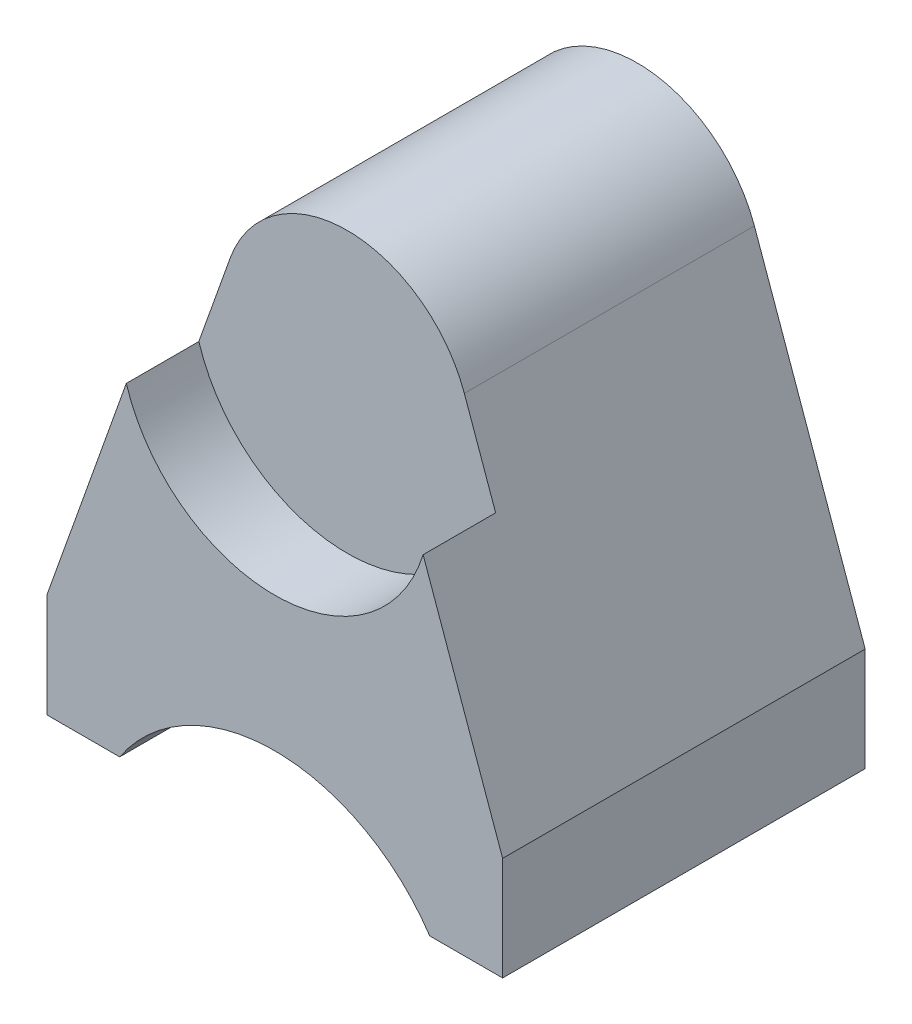
ISO-10303-21;
HEADER;
FILE_DESCRIPTION(('STEP AP214'),'2;1');
FILE_NAME('part.step','',(''),(''),'','','');
FILE_SCHEMA(('AUTOMOTIVE_DESIGN { 1 0 10303 214 1 1 1 1 }'));
ENDSEC;
DATA;
#1=APPLICATION_CONTEXT('core data for automotive mechanical design processes');
#2=APPLICATION_PROTOCOL_DEFINITION('international standard','automotive_design',2000,#1);
#3=PRODUCT_CONTEXT('',#1,'mechanical');
#4=PRODUCT('Part','Part','',(#3));
#5=PRODUCT_RELATED_PRODUCT_CATEGORY('part','',(#4));
#6=PRODUCT_DEFINITION_FORMATION('','',#4);
#7=PRODUCT_DEFINITION_CONTEXT('part definition',#1,'design');
#8=PRODUCT_DEFINITION('design','',#6,#7);
#9=PRODUCT_DEFINITION_SHAPE('','',#8);
#10=(LENGTH_UNIT() NAMED_UNIT(*) SI_UNIT(.MILLI.,.METRE.));
#11=(NAMED_UNIT(*) PLANE_ANGLE_UNIT() SI_UNIT($,.RADIAN.));
#12=(NAMED_UNIT(*) SI_UNIT($,.STERADIAN.) SOLID_ANGLE_UNIT());
#13=UNCERTAINTY_MEASURE_WITH_UNIT(LENGTH_MEASURE(1.E-05),#10,'distance_accuracy_value','');
#14=(GEOMETRIC_REPRESENTATION_CONTEXT(3) GLOBAL_UNCERTAINTY_ASSIGNED_CONTEXT((#13)) GLOBAL_UNIT_ASSIGNED_CONTEXT((#10,
#11,#12)) REPRESENTATION_CONTEXT('',''));
#15=CARTESIAN_POINT('',(0.,0.,0.));
#16=DIRECTION('',(0.,0.,1.));
#17=DIRECTION('',(1.,0.,0.));
#18=AXIS2_PLACEMENT_3D('',#15,#16,#17);
#19=CARTESIAN_POINT('',(0.,36.,17.5));
#20=DIRECTION('',(0.,0.,-1.));
#21=DIRECTION('',(-1.,0.,0.));
#22=AXIS2_PLACEMENT_3D('',#19,#20,#21);
#23=CYLINDRICAL_SURFACE('',#22,12.);
#24=CARTESIAN_POINT('',(0.,36.,10.5));
#25=DIRECTION('',(0.,0.,1.));
#26=DIRECTION('',(1.,0.,0.));
#27=AXIS2_PLACEMENT_3D('',#24,#25,#26);
#28=CIRCLE('',#27,12.);
#29=CARTESIAN_POINT('',(11.3042444216532,40.0266683567835,10.5));
#30=VERTEX_POINT('',#29);
#31=CARTESIAN_POINT('',(-11.3042444216532,40.0266683567835,10.5));
#32=VERTEX_POINT('',#31);
#33=EDGE_CURVE('E56',#30,#32,#28,.T.);
#34=ORIENTED_EDGE('',*,*,#33,.F.);
#35=DIRECTION('',(0.,0.,-1.));
#36=VECTOR('',#35,1.);
#37=CARTESIAN_POINT('',(11.3042444216532,40.0266683567835,17.5));
#38=LINE('',#37,#36);
#39=CARTESIAN_POINT('',(11.3042444216532,40.0266683567835,-17.5));
#40=VERTEX_POINT('',#39);
#41=EDGE_CURVE('E190',#30,#40,#38,.T.);
#42=ORIENTED_EDGE('',*,*,#41,.T.);
#43=CARTESIAN_POINT('',(0.,36.,-17.5));
#44=DIRECTION('',(0.,0.,1.));
#45=DIRECTION('',(-1.,0.,0.));
#46=AXIS2_PLACEMENT_3D('',#43,#44,#45);
#47=CIRCLE('',#46,12.);
#48=CARTESIAN_POINT('',(-11.3042444216532,40.0266683567835,-17.5));
#49=VERTEX_POINT('',#48);
#50=EDGE_CURVE('E170',#40,#49,#47,.T.);
#51=ORIENTED_EDGE('',*,*,#50,.T.);
#52=DIRECTION('',(0.,0.,-1.));
#53=VECTOR('',#52,1.);
#54=CARTESIAN_POINT('',(-11.3042444216532,40.0266683567835,17.5));
#55=LINE('',#54,#53);
#56=EDGE_CURVE('E142',#32,#49,#55,.T.);
#57=ORIENTED_EDGE('',*,*,#56,.F.);
#58=EDGE_LOOP('',(#34,#42,#51,#57));
#59=FACE_BOUND('',#58,.T.);
#60=ADVANCED_FACE('F42',(#59),#23,.T.);
#61=CARTESIAN_POINT('',(0.,-10.,17.5));
#62=DIRECTION('',(0.,0.,-1.));
#63=DIRECTION('',(-1.,0.,0.));
#64=AXIS2_PLACEMENT_3D('',#61,#62,#63);
#65=PLANE('',#64);
#66=CARTESIAN_POINT('',(0.,36.,17.5));
#67=DIRECTION('',(0.,0.,1.));
#68=DIRECTION('',(1.,0.,0.));
#69=AXIS2_PLACEMENT_3D('',#66,#67,#68);
#70=CIRCLE('',#69,15.);
#71=CARTESIAN_POINT('',(-14.3242456892409,31.5484850405436,17.5));
#72=VERTEX_POINT('',#71);
#73=CARTESIAN_POINT('',(14.3242456892409,31.5484850405436,17.5));
#74=VERTEX_POINT('',#73);
#75=EDGE_CURVE('E129',#72,#74,#70,.T.);
#76=ORIENTED_EDGE('',*,*,#75,.F.);
#77=DIRECTION('',(-0.335555696398626,-0.942020368471103,0.));
#78=VECTOR('',#77,1.);
#79=CARTESIAN_POINT('',(-22.,10.,17.5));
#80=LINE('',#79,#78);
#81=CARTESIAN_POINT('',(-22.,10.,17.5));
#82=VERTEX_POINT('',#81);
#83=EDGE_CURVE('E119',#72,#82,#80,.T.);
#84=ORIENTED_EDGE('',*,*,#83,.T.);
#85=DIRECTION('',(0.,-1.,0.));
#86=VECTOR('',#85,1.);
#87=CARTESIAN_POINT('',(-22.,0.,17.5));
#88=LINE('',#87,#86);
#89=CARTESIAN_POINT('',(-22.,0.,17.5));
#90=VERTEX_POINT('',#89);
#91=EDGE_CURVE('E125',#82,#90,#88,.T.);
#92=ORIENTED_EDGE('',*,*,#91,.T.);
#93=DIRECTION('',(1.,0.,0.));
#94=VECTOR('',#93,1.);
#95=CARTESIAN_POINT('',(-14.9666295470958,0.,17.5));
#96=LINE('',#95,#94);
#97=CARTESIAN_POINT('',(-14.9666295470958,0.,17.5));
#98=VERTEX_POINT('',#97);
#99=EDGE_CURVE('E66',#90,#98,#96,.T.);
#100=ORIENTED_EDGE('',*,*,#99,.T.);
#101=CARTESIAN_POINT('',(0.,-10.,17.5));
#102=DIRECTION('',(0.,0.,-1.));
#103=DIRECTION('',(-1.,0.,0.));
#104=AXIS2_PLACEMENT_3D('',#101,#102,#103);
#105=CIRCLE('',#104,18.);
#106=CARTESIAN_POINT('',(14.9666295470958,0.,17.5));
#107=VERTEX_POINT('',#106);
#108=EDGE_CURVE('E179',#98,#107,#105,.T.);
#109=ORIENTED_EDGE('',*,*,#108,.T.);
#110=DIRECTION('',(1.,0.,0.));
#111=VECTOR('',#110,1.);
#112=CARTESIAN_POINT('',(14.9666295470958,0.,17.5));
#113=LINE('',#112,#111);
#114=CARTESIAN_POINT('',(22.,0.,17.5));
#115=VERTEX_POINT('',#114);
#116=EDGE_CURVE('E106',#107,#115,#113,.T.);
#117=ORIENTED_EDGE('',*,*,#116,.T.);
#118=DIRECTION('',(0.,1.,0.));
#119=VECTOR('',#118,1.);
#120=CARTESIAN_POINT('',(22.,0.,17.5));
#121=LINE('',#120,#119);
#122=CARTESIAN_POINT('',(22.,10.,17.5));
#123=VERTEX_POINT('',#122);
#124=EDGE_CURVE('E225',#115,#123,#121,.T.);
#125=ORIENTED_EDGE('',*,*,#124,.T.);
#126=DIRECTION('',(-0.335555696398626,0.942020368471103,0.));
#127=VECTOR('',#126,1.);
#128=CARTESIAN_POINT('',(22.,10.,17.5));
#129=LINE('',#128,#127);
#130=EDGE_CURVE('E133',#123,#74,#129,.T.);
#131=ORIENTED_EDGE('',*,*,#130,.T.);
#132=EDGE_LOOP('',(#76,#84,#92,#100,#109,#117,#125,#131));
#133=FACE_BOUND('',#132,.T.);
#134=ADVANCED_FACE('F122',(#133),#65,.F.);
#135=CARTESIAN_POINT('',(0.,-10.,17.5));
#136=DIRECTION('',(0.,0.,-1.));
#137=DIRECTION('',(-1.,0.,0.));
#138=AXIS2_PLACEMENT_3D('',#135,#136,#137);
#139=CYLINDRICAL_SURFACE('',#138,18.);
#140=CARTESIAN_POINT('',(0.,-10.,-17.5));
#141=DIRECTION('',(0.,0.,-1.));
#142=DIRECTION('',(-1.,0.,0.));
#143=AXIS2_PLACEMENT_3D('',#140,#141,#142);
#144=CIRCLE('',#143,18.);
#145=CARTESIAN_POINT('',(-14.9666295470958,0.,-17.5));
#146=VERTEX_POINT('',#145);
#147=CARTESIAN_POINT('',(14.9666295470958,0.,-17.5));
#148=VERTEX_POINT('',#147);
#149=EDGE_CURVE('E154',#146,#148,#144,.T.);
#150=ORIENTED_EDGE('',*,*,#149,.T.);
#151=DIRECTION('',(0.,0.,-1.));
#152=VECTOR('',#151,1.);
#153=CARTESIAN_POINT('',(14.9666295470958,0.,17.5));
#154=LINE('',#153,#152);
#155=EDGE_CURVE('E52',#107,#148,#154,.T.);
#156=ORIENTED_EDGE('',*,*,#155,.F.);
#157=ORIENTED_EDGE('',*,*,#108,.F.);
#158=DIRECTION('',(0.,0.,-1.));
#159=VECTOR('',#158,1.);
#160=CARTESIAN_POINT('',(-14.9666295470958,0.,17.5));
#161=LINE('',#160,#159);
#162=EDGE_CURVE('E148',#98,#146,#161,.T.);
#163=ORIENTED_EDGE('',*,*,#162,.T.);
#164=EDGE_LOOP('',(#150,#156,#157,#163));
#165=FACE_BOUND('',#164,.T.);
#166=ADVANCED_FACE('F46',(#165),#139,.F.);
#167=CARTESIAN_POINT('',(14.9666295470958,0.,17.5));
#168=DIRECTION('',(0.,1.,0.));
#169=DIRECTION('',(0.,0.,1.));
#170=AXIS2_PLACEMENT_3D('',#167,#168,#169);
#171=PLANE('',#170);
#172=DIRECTION('',(1.,0.,0.));
#173=VECTOR('',#172,1.);
#174=CARTESIAN_POINT('',(14.9666295470958,0.,-17.5));
#175=LINE('',#174,#173);
#176=CARTESIAN_POINT('',(22.,0.,-17.5));
#177=VERTEX_POINT('',#176);
#178=EDGE_CURVE('E156',#148,#177,#175,.T.);
#179=ORIENTED_EDGE('',*,*,#178,.T.);
#180=DIRECTION('',(0.,0.,-1.));
#181=VECTOR('',#180,1.);
#182=CARTESIAN_POINT('',(22.,0.,17.5));
#183=LINE('',#182,#181);
#184=EDGE_CURVE('E191',#115,#177,#183,.T.);
#185=ORIENTED_EDGE('',*,*,#184,.F.);
#186=ORIENTED_EDGE('',*,*,#116,.F.);
#187=ORIENTED_EDGE('',*,*,#155,.T.);
#188=EDGE_LOOP('',(#179,#185,#186,#187));
#189=FACE_BOUND('',#188,.T.);
#190=ADVANCED_FACE('F199',(#189),#171,.F.);
#191=CARTESIAN_POINT('',(22.,0.,17.5));
#192=DIRECTION('',(-1.,0.,0.));
#193=DIRECTION('',(0.,0.,1.));
#194=AXIS2_PLACEMENT_3D('',#191,#192,#193);
#195=PLANE('',#194);
#196=DIRECTION('',(0.,1.,0.));
#197=VECTOR('',#196,1.);
#198=CARTESIAN_POINT('',(22.,0.,-17.5));
#199=LINE('',#198,#197);
#200=CARTESIAN_POINT('',(22.,10.,-17.5));
#201=VERTEX_POINT('',#200);
#202=EDGE_CURVE('E165',#177,#201,#199,.T.);
#203=ORIENTED_EDGE('',*,*,#202,.T.);
#204=DIRECTION('',(0.,0.,-1.));
#205=VECTOR('',#204,1.);
#206=CARTESIAN_POINT('',(22.,10.,17.5));
#207=LINE('',#206,#205);
#208=EDGE_CURVE('E189',#123,#201,#207,.T.);
#209=ORIENTED_EDGE('',*,*,#208,.F.);
#210=ORIENTED_EDGE('',*,*,#124,.F.);
#211=ORIENTED_EDGE('',*,*,#184,.T.);
#212=EDGE_LOOP('',(#203,#209,#210,#211));
#213=FACE_BOUND('',#212,.T.);
#214=ADVANCED_FACE('F209',(#213),#195,.F.);
#215=CARTESIAN_POINT('',(22.,10.,17.5));
#216=DIRECTION('',(-0.942020368471103,-0.335555696398626,0.));
#217=DIRECTION('',(0.335555696398626,-0.942020368471103,0.));
#218=AXIS2_PLACEMENT_3D('',#215,#216,#217);
#219=PLANE('',#218);
#220=DIRECTION('',(-0.335555696398626,0.942020368471103,0.));
#221=VECTOR('',#220,1.);
#222=CARTESIAN_POINT('',(22.,10.,10.5));
#223=LINE('',#222,#221);
#224=CARTESIAN_POINT('',(14.3242456892409,31.5484850405436,10.5));
#225=VERTEX_POINT('',#224);
#226=EDGE_CURVE('E159',#225,#30,#223,.T.);
#227=ORIENTED_EDGE('',*,*,#226,.F.);
#228=DIRECTION('',(0.,0.,1.));
#229=VECTOR('',#228,1.);
#230=CARTESIAN_POINT('',(14.3242456892409,31.5484850405436,10.5));
#231=LINE('',#230,#229);
#232=EDGE_CURVE('E217',#225,#74,#231,.T.);
#233=ORIENTED_EDGE('',*,*,#232,.T.);
#234=ORIENTED_EDGE('',*,*,#130,.F.);
#235=ORIENTED_EDGE('',*,*,#208,.T.);
#236=DIRECTION('',(-0.335555696398626,0.942020368471103,0.));
#237=VECTOR('',#236,1.);
#238=CARTESIAN_POINT('',(22.,10.,-17.5));
#239=LINE('',#238,#237);
#240=EDGE_CURVE('E164',#201,#40,#239,.T.);
#241=ORIENTED_EDGE('',*,*,#240,.T.);
#242=ORIENTED_EDGE('',*,*,#41,.F.);
#243=EDGE_LOOP('',(#227,#233,#234,#235,#241,#242));
#244=FACE_BOUND('',#243,.T.);
#245=ADVANCED_FACE('F214',(#244),#219,.F.);
#246=CARTESIAN_POINT('',(-22.,10.,17.5));
#247=DIRECTION('',(0.942020368471103,-0.335555696398626,0.));
#248=DIRECTION('',(0.335555696398626,0.942020368471103,0.));
#249=AXIS2_PLACEMENT_3D('',#246,#247,#248);
#250=PLANE('',#249);
#251=ORIENTED_EDGE('',*,*,#83,.F.);
#252=DIRECTION('',(0.,0.,1.));
#253=VECTOR('',#252,1.);
#254=CARTESIAN_POINT('',(-14.3242456892409,31.5484850405436,10.5));
#255=LINE('',#254,#253);
#256=CARTESIAN_POINT('',(-14.3242456892409,31.5484850405436,10.5));
#257=VERTEX_POINT('',#256);
#258=EDGE_CURVE('E237',#72,#257,#255,.F.);
#259=ORIENTED_EDGE('',*,*,#258,.T.);
#260=DIRECTION('',(-0.335555696398626,-0.942020368471103,0.));
#261=VECTOR('',#260,1.);
#262=CARTESIAN_POINT('',(-22.,10.,10.5));
#263=LINE('',#262,#261);
#264=EDGE_CURVE('E11',#32,#257,#263,.T.);
#265=ORIENTED_EDGE('',*,*,#264,.F.);
#266=ORIENTED_EDGE('',*,*,#56,.T.);
#267=DIRECTION('',(-0.335555696398626,-0.942020368471103,0.));
#268=VECTOR('',#267,1.);
#269=CARTESIAN_POINT('',(-22.,10.,-17.5));
#270=LINE('',#269,#268);
#271=CARTESIAN_POINT('',(-22.,10.,-17.5));
#272=VERTEX_POINT('',#271);
#273=EDGE_CURVE('E137',#49,#272,#270,.T.);
#274=ORIENTED_EDGE('',*,*,#273,.T.);
#275=DIRECTION('',(0.,0.,-1.));
#276=VECTOR('',#275,1.);
#277=CARTESIAN_POINT('',(-22.,10.,17.5));
#278=LINE('',#277,#276);
#279=EDGE_CURVE('E136',#82,#272,#278,.T.);
#280=ORIENTED_EDGE('',*,*,#279,.F.);
#281=EDGE_LOOP('',(#251,#259,#265,#266,#274,#280));
#282=FACE_BOUND('',#281,.T.);
#283=ADVANCED_FACE('F140',(#282),#250,.F.);
#284=CARTESIAN_POINT('',(-22.,0.,17.5));
#285=DIRECTION('',(1.,0.,0.));
#286=DIRECTION('',(0.,0.,-1.));
#287=AXIS2_PLACEMENT_3D('',#284,#285,#286);
#288=PLANE('',#287);
#289=DIRECTION('',(0.,-1.,0.));
#290=VECTOR('',#289,1.);
#291=CARTESIAN_POINT('',(-22.,0.,-17.5));
#292=LINE('',#291,#290);
#293=CARTESIAN_POINT('',(-22.,0.,-17.5));
#294=VERTEX_POINT('',#293);
#295=EDGE_CURVE('E172',#272,#294,#292,.T.);
#296=ORIENTED_EDGE('',*,*,#295,.T.);
#297=DIRECTION('',(0.,0.,-1.));
#298=VECTOR('',#297,1.);
#299=CARTESIAN_POINT('',(-22.,0.,17.5));
#300=LINE('',#299,#298);
#301=EDGE_CURVE('E143',#90,#294,#300,.T.);
#302=ORIENTED_EDGE('',*,*,#301,.F.);
#303=ORIENTED_EDGE('',*,*,#91,.F.);
#304=ORIENTED_EDGE('',*,*,#279,.T.);
#305=EDGE_LOOP('',(#296,#302,#303,#304));
#306=FACE_BOUND('',#305,.T.);
#307=ADVANCED_FACE('F147',(#306),#288,.F.);
#308=CARTESIAN_POINT('',(-14.9666295470958,0.,17.5));
#309=DIRECTION('',(0.,1.,0.));
#310=DIRECTION('',(0.,0.,1.));
#311=AXIS2_PLACEMENT_3D('',#308,#309,#310);
#312=PLANE('',#311);
#313=DIRECTION('',(1.,0.,0.));
#314=VECTOR('',#313,1.);
#315=CARTESIAN_POINT('',(-14.9666295470958,0.,-17.5));
#316=LINE('',#315,#314);
#317=EDGE_CURVE('E102',#294,#146,#316,.T.);
#318=ORIENTED_EDGE('',*,*,#317,.T.);
#319=ORIENTED_EDGE('',*,*,#162,.F.);
#320=ORIENTED_EDGE('',*,*,#99,.F.);
#321=ORIENTED_EDGE('',*,*,#301,.T.);
#322=EDGE_LOOP('',(#318,#319,#320,#321));
#323=FACE_BOUND('',#322,.T.);
#324=ADVANCED_FACE('F312',(#323),#312,.F.);
#325=CARTESIAN_POINT('',(0.,-10.,-17.5));
#326=DIRECTION('',(0.,0.,-1.));
#327=DIRECTION('',(-1.,0.,0.));
#328=AXIS2_PLACEMENT_3D('',#325,#326,#327);
#329=PLANE('',#328);
#330=ORIENTED_EDGE('',*,*,#149,.F.);
#331=ORIENTED_EDGE('',*,*,#317,.F.);
#332=ORIENTED_EDGE('',*,*,#295,.F.);
#333=ORIENTED_EDGE('',*,*,#273,.F.);
#334=ORIENTED_EDGE('',*,*,#50,.F.);
#335=ORIENTED_EDGE('',*,*,#240,.F.);
#336=ORIENTED_EDGE('',*,*,#202,.F.);
#337=ORIENTED_EDGE('',*,*,#178,.F.);
#338=EDGE_LOOP('',(#330,#331,#332,#333,#334,#335,#336,#337));
#339=FACE_BOUND('',#338,.T.);
#340=ADVANCED_FACE('F204',(#339),#329,.T.);
#341=CARTESIAN_POINT('',(0.,36.,10.5));
#342=DIRECTION('',(0.,0.,1.));
#343=DIRECTION('',(1.,0.,0.));
#344=AXIS2_PLACEMENT_3D('',#341,#342,#343);
#345=PLANE('',#344);
#346=ORIENTED_EDGE('',*,*,#226,.T.);
#347=ORIENTED_EDGE('',*,*,#33,.T.);
#348=ORIENTED_EDGE('',*,*,#264,.T.);
#349=CARTESIAN_POINT('',(0.,36.,10.5));
#350=DIRECTION('',(0.,0.,1.));
#351=DIRECTION('',(1.,0.,0.));
#352=AXIS2_PLACEMENT_3D('',#349,#350,#351);
#353=CIRCLE('',#352,15.);
#354=EDGE_CURVE('E236',#257,#225,#353,.T.);
#355=ORIENTED_EDGE('',*,*,#354,.T.);
#356=EDGE_LOOP('',(#346,#347,#348,#355));
#357=FACE_BOUND('',#356,.T.);
#358=ADVANCED_FACE('F247',(#357),#345,.T.);
#359=CARTESIAN_POINT('',(0.,36.,10.5));
#360=DIRECTION('',(0.,0.,1.));
#361=DIRECTION('',(1.,0.,0.));
#362=AXIS2_PLACEMENT_3D('',#359,#360,#361);
#363=CYLINDRICAL_SURFACE('',#362,15.);
#364=ORIENTED_EDGE('',*,*,#354,.F.);
#365=ORIENTED_EDGE('',*,*,#258,.F.);
#366=ORIENTED_EDGE('',*,*,#75,.T.);
#367=ORIENTED_EDGE('',*,*,#232,.F.);
#368=EDGE_LOOP('',(#364,#365,#366,#367));
#369=FACE_BOUND('',#368,.T.);
#370=ADVANCED_FACE('F252',(#369),#363,.F.);
#371=CLOSED_SHELL('',(#60,#134,#166,#190,#214,#245,#283,#307,#324,#340,#358,#370));
#372=MANIFOLD_SOLID_BREP('B2',#371);
#373=ADVANCED_BREP_SHAPE_REPRESENTATION('',(#18,#372),#14);
#374=SHAPE_DEFINITION_REPRESENTATION(#9,#373);
ENDSEC;
END-ISO-10303-21;
